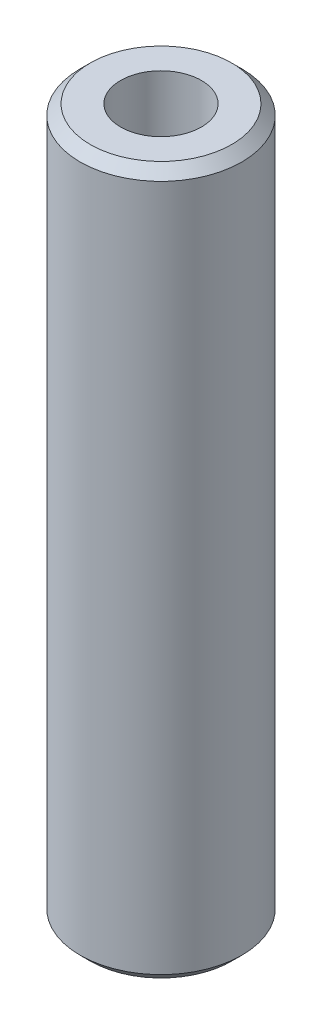
ISO-10303-21;
HEADER;
FILE_DESCRIPTION(('STEP AP214'),'2;1');
FILE_NAME('part.step','',(''),(''),'','','');
FILE_SCHEMA(('AUTOMOTIVE_DESIGN { 1 0 10303 214 1 1 1 1 }'));
ENDSEC;
DATA;
#1=APPLICATION_CONTEXT('core data for automotive mechanical design processes');
#2=APPLICATION_PROTOCOL_DEFINITION('international standard','automotive_design',2000,#1);
#3=PRODUCT_CONTEXT('',#1,'mechanical');
#4=PRODUCT('Part','Part','',(#3));
#5=PRODUCT_RELATED_PRODUCT_CATEGORY('part','',(#4));
#6=PRODUCT_DEFINITION_FORMATION('','',#4);
#7=PRODUCT_DEFINITION_CONTEXT('part definition',#1,'design');
#8=PRODUCT_DEFINITION('design','',#6,#7);
#9=PRODUCT_DEFINITION_SHAPE('','',#8);
#10=(LENGTH_UNIT() NAMED_UNIT(*) SI_UNIT(.MILLI.,.METRE.));
#11=(NAMED_UNIT(*) PLANE_ANGLE_UNIT() SI_UNIT($,.RADIAN.));
#12=(NAMED_UNIT(*) SI_UNIT($,.STERADIAN.) SOLID_ANGLE_UNIT());
#13=UNCERTAINTY_MEASURE_WITH_UNIT(LENGTH_MEASURE(1.E-05),#10,'distance_accuracy_value','');
#14=(GEOMETRIC_REPRESENTATION_CONTEXT(3) GLOBAL_UNCERTAINTY_ASSIGNED_CONTEXT((#13)) GLOBAL_UNIT_ASSIGNED_CONTEXT((#10,
#11,#12)) REPRESENTATION_CONTEXT('',''));
#15=CARTESIAN_POINT('',(0.,0.,0.));
#16=DIRECTION('',(0.,0.,1.));
#17=DIRECTION('',(1.,0.,0.));
#18=AXIS2_PLACEMENT_3D('',#15,#16,#17);
#19=CARTESIAN_POINT('',(0.,35.,0.));
#20=DIRECTION('',(0.,1.,0.));
#21=DIRECTION('',(0.,0.,1.));
#22=AXIS2_PLACEMENT_3D('',#19,#20,#21);
#23=PLANE('',#22);
#24=CARTESIAN_POINT('',(0.,35.,0.));
#25=DIRECTION('',(0.,1.,0.));
#26=DIRECTION('',(0.,0.,1.));
#27=AXIS2_PLACEMENT_3D('',#24,#25,#26);
#28=CIRCLE('',#27,3.50000000000001);
#29=CARTESIAN_POINT('',(0.,35.,3.50000000000001));
#30=VERTEX_POINT('',#29);
#31=EDGE_CURVE('E10',#30,#30,#28,.T.);
#32=ORIENTED_EDGE('',*,*,#31,.T.);
#33=EDGE_LOOP('',(#32));
#34=FACE_BOUND('',#33,.T.);
#35=CARTESIAN_POINT('',(0.,35.,0.));
#36=DIRECTION('',(0.,1.,0.));
#37=DIRECTION('',(0.,0.,1.));
#38=AXIS2_PLACEMENT_3D('',#35,#36,#37);
#39=CIRCLE('',#38,2.);
#40=CARTESIAN_POINT('',(0.,35.,2.));
#41=VERTEX_POINT('',#40);
#42=EDGE_CURVE('E60',#41,#41,#39,.T.);
#43=ORIENTED_EDGE('',*,*,#42,.F.);
#44=EDGE_LOOP('',(#43));
#45=FACE_BOUND('',#44,.T.);
#46=ADVANCED_FACE('F39',(#34,#45),#23,.T.);
#47=CARTESIAN_POINT('',(0.,0.,0.));
#48=DIRECTION('',(0.,1.,0.));
#49=DIRECTION('',(0.,0.,1.));
#50=AXIS2_PLACEMENT_3D('',#47,#48,#49);
#51=PLANE('',#50);
#52=CARTESIAN_POINT('',(0.,0.,0.));
#53=DIRECTION('',(0.,1.,0.));
#54=DIRECTION('',(0.,0.,1.));
#55=AXIS2_PLACEMENT_3D('',#52,#53,#54);
#56=CIRCLE('',#55,3.49999999999999);
#57=CARTESIAN_POINT('',(0.,0.,3.49999999999999));
#58=VERTEX_POINT('',#57);
#59=EDGE_CURVE('E47',#58,#58,#56,.F.);
#60=ORIENTED_EDGE('',*,*,#59,.T.);
#61=EDGE_LOOP('',(#60));
#62=FACE_BOUND('',#61,.T.);
#63=CARTESIAN_POINT('',(0.,0.,0.));
#64=DIRECTION('',(0.,1.,0.));
#65=DIRECTION('',(0.,0.,1.));
#66=AXIS2_PLACEMENT_3D('',#63,#64,#65);
#67=CIRCLE('',#66,2.);
#68=CARTESIAN_POINT('',(0.,0.,2.));
#69=VERTEX_POINT('',#68);
#70=EDGE_CURVE('E61',#69,#69,#67,.T.);
#71=ORIENTED_EDGE('',*,*,#70,.T.);
#72=EDGE_LOOP('',(#71));
#73=FACE_BOUND('',#72,.T.);
#74=ADVANCED_FACE('F71',(#62,#73),#51,.F.);
#75=CARTESIAN_POINT('',(0.,35.,0.));
#76=DIRECTION('',(0.,-1.,0.));
#77=DIRECTION('',(0.,0.,-1.));
#78=AXIS2_PLACEMENT_3D('',#75,#76,#77);
#79=CYLINDRICAL_SURFACE('',#78,4.);
#80=CARTESIAN_POINT('',(0.,0.500000000000014,0.));
#81=DIRECTION('',(0.,1.,0.));
#82=DIRECTION('',(0.,0.,1.));
#83=AXIS2_PLACEMENT_3D('',#80,#81,#82);
#84=CIRCLE('',#83,4.);
#85=CARTESIAN_POINT('',(0.,0.500000000000014,4.));
#86=VERTEX_POINT('',#85);
#87=EDGE_CURVE('E51',#86,#86,#84,.T.);
#88=ORIENTED_EDGE('',*,*,#87,.T.);
#89=EDGE_LOOP('',(#88));
#90=FACE_BOUND('',#89,.T.);
#91=CARTESIAN_POINT('',(0.,34.5,0.));
#92=DIRECTION('',(0.,1.,0.));
#93=DIRECTION('',(0.,0.,1.));
#94=AXIS2_PLACEMENT_3D('',#91,#92,#93);
#95=CIRCLE('',#94,4.);
#96=CARTESIAN_POINT('',(0.,34.5,4.));
#97=VERTEX_POINT('',#96);
#98=EDGE_CURVE('E55',#97,#97,#95,.F.);
#99=ORIENTED_EDGE('',*,*,#98,.T.);
#100=EDGE_LOOP('',(#99));
#101=FACE_BOUND('',#100,.T.);
#102=ADVANCED_FACE('F77',(#90,#101),#79,.T.);
#103=CARTESIAN_POINT('',(0.,35.,0.));
#104=DIRECTION('',(0.,-1.,0.));
#105=DIRECTION('',(0.,0.,-1.));
#106=AXIS2_PLACEMENT_3D('',#103,#104,#105);
#107=CYLINDRICAL_SURFACE('',#106,2.);
#108=ORIENTED_EDGE('',*,*,#42,.T.);
#109=EDGE_LOOP('',(#108));
#110=FACE_BOUND('',#109,.T.);
#111=ORIENTED_EDGE('',*,*,#70,.F.);
#112=EDGE_LOOP('',(#111));
#113=FACE_BOUND('',#112,.T.);
#114=ADVANCED_FACE('F67',(#110,#113),#107,.F.);
#115=CARTESIAN_POINT('',(0.,0.500000000000014,0.));
#116=DIRECTION('',(0.,1.,0.));
#117=DIRECTION('',(0.,0.,1.));
#118=AXIS2_PLACEMENT_3D('',#115,#116,#117);
#119=CONICAL_SURFACE('',#118,4.,0.785398163397445);
#120=ORIENTED_EDGE('',*,*,#59,.F.);
#121=EDGE_LOOP('',(#120));
#122=FACE_BOUND('',#121,.T.);
#123=ORIENTED_EDGE('',*,*,#87,.F.);
#124=EDGE_LOOP('',(#123));
#125=FACE_BOUND('',#124,.T.);
#126=ADVANCED_FACE('F84',(#122,#125),#119,.T.);
#127=CARTESIAN_POINT('',(0.,35.,0.));
#128=DIRECTION('',(0.,-1.,0.));
#129=DIRECTION('',(0.,0.,-1.));
#130=AXIS2_PLACEMENT_3D('',#127,#128,#129);
#131=CONICAL_SURFACE('',#130,3.50000000000001,0.785398163397441);
#132=ORIENTED_EDGE('',*,*,#98,.F.);
#133=EDGE_LOOP('',(#132));
#134=FACE_BOUND('',#133,.T.);
#135=ORIENTED_EDGE('',*,*,#31,.F.);
#136=EDGE_LOOP('',(#135));
#137=FACE_BOUND('',#136,.T.);
#138=ADVANCED_FACE('F42',(#134,#137),#131,.T.);
#139=CLOSED_SHELL('',(#46,#74,#102,#114,#126,#138));
#140=MANIFOLD_SOLID_BREP('B2',#139);
#141=ADVANCED_BREP_SHAPE_REPRESENTATION('',(#18,#140),#14);
#142=SHAPE_DEFINITION_REPRESENTATION(#9,#141);
ENDSEC;
END-ISO-10303-21;
